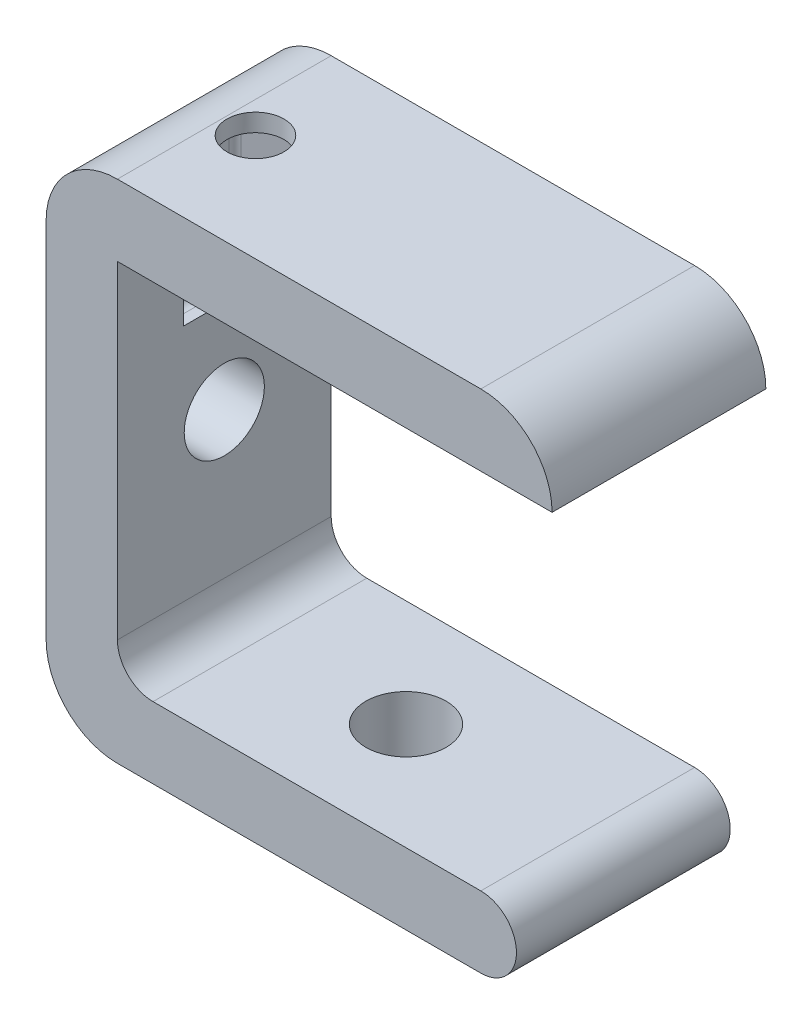
ISO-10303-21;
HEADER;
FILE_DESCRIPTION(('STEP AP214'),'2;1');
FILE_NAME('part.step','',(''),(''),'','','');
FILE_SCHEMA(('AUTOMOTIVE_DESIGN { 1 0 10303 214 1 1 1 1 }'));
ENDSEC;
DATA;
#1=APPLICATION_CONTEXT('core data for automotive mechanical design processes');
#2=APPLICATION_PROTOCOL_DEFINITION('international standard','automotive_design',2000,#1);
#3=PRODUCT_CONTEXT('',#1,'mechanical');
#4=PRODUCT('Part','Part','',(#3));
#5=PRODUCT_RELATED_PRODUCT_CATEGORY('part','',(#4));
#6=PRODUCT_DEFINITION_FORMATION('','',#4);
#7=PRODUCT_DEFINITION_CONTEXT('part definition',#1,'design');
#8=PRODUCT_DEFINITION('design','',#6,#7);
#9=PRODUCT_DEFINITION_SHAPE('','',#8);
#10=(LENGTH_UNIT() NAMED_UNIT(*) SI_UNIT(.MILLI.,.METRE.));
#11=(NAMED_UNIT(*) PLANE_ANGLE_UNIT() SI_UNIT($,.RADIAN.));
#12=(NAMED_UNIT(*) SI_UNIT($,.STERADIAN.) SOLID_ANGLE_UNIT());
#13=UNCERTAINTY_MEASURE_WITH_UNIT(LENGTH_MEASURE(1.E-05),#10,'distance_accuracy_value','');
#14=(GEOMETRIC_REPRESENTATION_CONTEXT(3) GLOBAL_UNCERTAINTY_ASSIGNED_CONTEXT((#13)) GLOBAL_UNIT_ASSIGNED_CONTEXT((#10,
#11,#12)) REPRESENTATION_CONTEXT('',''));
#15=CARTESIAN_POINT('',(0.,0.,0.));
#16=DIRECTION('',(0.,0.,1.));
#17=DIRECTION('',(1.,0.,0.));
#18=AXIS2_PLACEMENT_3D('',#15,#16,#17);
#19=CARTESIAN_POINT('',(-10.2,0.,6.));
#20=DIRECTION('',(1.,0.,0.));
#21=DIRECTION('',(0.,0.,-1.));
#22=AXIS2_PLACEMENT_3D('',#19,#20,#21);
#23=PLANE('',#22);
#24=CARTESIAN_POINT('',(-10.2,0.,0.));
#25=DIRECTION('',(1.,0.,0.));
#26=DIRECTION('',(0.,0.,-1.));
#27=AXIS2_PLACEMENT_3D('',#24,#25,#26);
#28=CIRCLE('',#27,2.25);
#29=CARTESIAN_POINT('',(-10.2,0.,-2.25));
#30=VERTEX_POINT('',#29);
#31=EDGE_CURVE('E248',#30,#30,#28,.T.);
#32=ORIENTED_EDGE('',*,*,#31,.F.);
#33=EDGE_LOOP('',(#32));
#34=FACE_BOUND('',#33,.T.);
#35=DIRECTION('',(0.,-1.,0.));
#36=VECTOR('',#35,1.);
#37=CARTESIAN_POINT('',(-10.2,0.,6.));
#38=LINE('',#37,#36);
#39=CARTESIAN_POINT('',(-10.2,10.2,6.));
#40=VERTEX_POINT('',#39);
#41=CARTESIAN_POINT('',(-10.2,-8.2,6.));
#42=VERTEX_POINT('',#41);
#43=EDGE_CURVE('E303',#40,#42,#38,.T.);
#44=ORIENTED_EDGE('',*,*,#43,.T.);
#45=DIRECTION('',(0.,0.,-1.));
#46=VECTOR('',#45,1.);
#47=CARTESIAN_POINT('',(-10.2,-8.2,-6.));
#48=LINE('',#47,#46);
#49=CARTESIAN_POINT('',(-10.2,-8.2,-6.));
#50=VERTEX_POINT('',#49);
#51=EDGE_CURVE('E287',#42,#50,#48,.T.);
#52=ORIENTED_EDGE('',*,*,#51,.T.);
#53=DIRECTION('',(0.,-1.,0.));
#54=VECTOR('',#53,1.);
#55=CARTESIAN_POINT('',(-10.2,0.,-6.));
#56=LINE('',#55,#54);
#57=CARTESIAN_POINT('',(-10.2,10.2,-6.));
#58=VERTEX_POINT('',#57);
#59=EDGE_CURVE('E296',#58,#50,#56,.T.);
#60=ORIENTED_EDGE('',*,*,#59,.F.);
#61=DIRECTION('',(0.,0.,-1.));
#62=VECTOR('',#61,1.);
#63=CARTESIAN_POINT('',(-10.2,10.2,6.));
#64=LINE('',#63,#62);
#65=CARTESIAN_POINT('',(-10.2,10.2,-2.28053356329902));
#66=VERTEX_POINT('',#65);
#67=EDGE_CURVE('E211',#66,#58,#64,.T.);
#68=ORIENTED_EDGE('',*,*,#67,.F.);
#69=DIRECTION('',(0.,-1.,0.));
#70=VECTOR('',#69,1.);
#71=CARTESIAN_POINT('',(-10.2,0.,-2.28053356329902));
#72=LINE('',#71,#70);
#73=CARTESIAN_POINT('',(-10.2,5.2,-2.28053356329902));
#74=VERTEX_POINT('',#73);
#75=EDGE_CURVE('E193',#66,#74,#72,.T.);
#76=ORIENTED_EDGE('',*,*,#75,.T.);
#77=DIRECTION('',(0.,0.,-1.));
#78=VECTOR('',#77,1.);
#79=CARTESIAN_POINT('',(-10.2,5.2,6.));
#80=LINE('',#79,#78);
#81=CARTESIAN_POINT('',(-10.2,5.2,2.28053356329902));
#82=VERTEX_POINT('',#81);
#83=EDGE_CURVE('E190',#82,#74,#80,.T.);
#84=ORIENTED_EDGE('',*,*,#83,.F.);
#85=DIRECTION('',(0.,-1.,0.));
#86=VECTOR('',#85,1.);
#87=CARTESIAN_POINT('',(-10.2,0.,2.28053356329902));
#88=LINE('',#87,#86);
#89=CARTESIAN_POINT('',(-10.2,10.2,2.28053356329902));
#90=VERTEX_POINT('',#89);
#91=EDGE_CURVE('E183',#90,#82,#88,.T.);
#92=ORIENTED_EDGE('',*,*,#91,.F.);
#93=EDGE_CURVE('E186',#40,#90,#64,.T.);
#94=ORIENTED_EDGE('',*,*,#93,.F.);
#95=EDGE_LOOP('',(#44,#52,#60,#68,#76,#84,#92,#94));
#96=FACE_BOUND('',#95,.T.);
#97=ADVANCED_FACE('F34',(#34,#96),#23,.T.);
#98=CARTESIAN_POINT('',(-8.45,5.67451660040609,0.));
#99=DIRECTION('',(0.,1.,0.));
#100=DIRECTION('',(0.,0.,1.));
#101=AXIS2_PLACEMENT_3D('',#98,#99,#100);
#102=CYLINDRICAL_SURFACE('',#101,1.6);
#103=CARTESIAN_POINT('',(-8.45,14.2,0.));
#104=DIRECTION('',(0.,1.,0.));
#105=DIRECTION('',(0.,0.,1.));
#106=AXIS2_PLACEMENT_3D('',#103,#104,#105);
#107=CIRCLE('',#106,1.6);
#108=CARTESIAN_POINT('',(-8.45,14.2,1.6));
#109=VERTEX_POINT('',#108);
#110=EDGE_CURVE('E221',#109,#109,#107,.T.);
#111=ORIENTED_EDGE('',*,*,#110,.T.);
#112=EDGE_LOOP('',(#111));
#113=FACE_BOUND('',#112,.T.);
#114=CARTESIAN_POINT('',(-8.45,13.2,0.));
#115=DIRECTION('',(0.,-1.,0.));
#116=DIRECTION('',(0.,0.,-1.));
#117=AXIS2_PLACEMENT_3D('',#114,#115,#116);
#118=CIRCLE('',#117,1.6);
#119=CARTESIAN_POINT('',(-8.45,13.2,-1.6));
#120=VERTEX_POINT('',#119);
#121=EDGE_CURVE('E219',#120,#120,#118,.F.);
#122=ORIENTED_EDGE('',*,*,#121,.F.);
#123=EDGE_LOOP('',(#122));
#124=FACE_BOUND('',#123,.T.);
#125=ADVANCED_FACE('F401',(#113,#124),#102,.F.);
#126=CARTESIAN_POINT('',(0.,-10.2,6.));
#127=DIRECTION('',(0.,1.,0.));
#128=DIRECTION('',(0.,0.,1.));
#129=AXIS2_PLACEMENT_3D('',#126,#127,#128);
#130=PLANE('',#129);
#131=CARTESIAN_POINT('',(0.,-10.2,0.));
#132=DIRECTION('',(0.,1.,0.));
#133=DIRECTION('',(0.,0.,1.));
#134=AXIS2_PLACEMENT_3D('',#131,#132,#133);
#135=CIRCLE('',#134,2.25);
#136=CARTESIAN_POINT('',(0.,-10.2,2.25));
#137=VERTEX_POINT('',#136);
#138=EDGE_CURVE('E502',#137,#137,#135,.T.);
#139=ORIENTED_EDGE('',*,*,#138,.F.);
#140=EDGE_LOOP('',(#139));
#141=FACE_BOUND('',#140,.T.);
#142=DIRECTION('',(1.,0.,0.));
#143=VECTOR('',#142,1.);
#144=CARTESIAN_POINT('',(0.,-10.2,6.));
#145=LINE('',#144,#143);
#146=CARTESIAN_POINT('',(-8.2,-10.2,6.));
#147=VERTEX_POINT('',#146);
#148=CARTESIAN_POINT('',(10.2,-10.2,6.));
#149=VERTEX_POINT('',#148);
#150=EDGE_CURVE('E304',#147,#149,#145,.T.);
#151=ORIENTED_EDGE('',*,*,#150,.T.);
#152=DIRECTION('',(0.,0.,1.));
#153=VECTOR('',#152,1.);
#154=CARTESIAN_POINT('',(10.2,-10.2,6.));
#155=LINE('',#154,#153);
#156=CARTESIAN_POINT('',(10.2,-10.2,-6.));
#157=VERTEX_POINT('',#156);
#158=EDGE_CURVE('E280',#149,#157,#155,.F.);
#159=ORIENTED_EDGE('',*,*,#158,.T.);
#160=DIRECTION('',(1.,0.,0.));
#161=VECTOR('',#160,1.);
#162=CARTESIAN_POINT('',(0.,-10.2,-6.));
#163=LINE('',#162,#161);
#164=CARTESIAN_POINT('',(-8.2,-10.2,-6.));
#165=VERTEX_POINT('',#164);
#166=EDGE_CURVE('E293',#165,#157,#163,.T.);
#167=ORIENTED_EDGE('',*,*,#166,.F.);
#168=DIRECTION('',(0.,0.,-1.));
#169=VECTOR('',#168,1.);
#170=CARTESIAN_POINT('',(-8.2,-10.2,6.));
#171=LINE('',#170,#169);
#172=EDGE_CURVE('E278',#165,#147,#171,.F.);
#173=ORIENTED_EDGE('',*,*,#172,.T.);
#174=EDGE_LOOP('',(#151,#159,#167,#173));
#175=FACE_BOUND('',#174,.T.);
#176=ADVANCED_FACE('F299',(#141,#175),#130,.T.);
#177=CARTESIAN_POINT('',(0.,10.2,6.));
#178=DIRECTION('',(0.,1.,0.));
#179=DIRECTION('',(0.,0.,1.));
#180=AXIS2_PLACEMENT_3D('',#177,#178,#179);
#181=PLANE('',#180);
#182=DIRECTION('',(0.866025403784439,0.,0.5));
#183=VECTOR('',#182,1.);
#184=CARTESIAN_POINT('',(-8.45,10.2,-3.29089653438087));
#185=LINE('',#184,#183);
#186=CARTESIAN_POINT('',(-8.45,10.2,-3.29089653438087));
#187=VERTEX_POINT('',#186);
#188=CARTESIAN_POINT('',(-5.6,10.2,-1.64544826719043));
#189=VERTEX_POINT('',#188);
#190=EDGE_CURVE('E387',#187,#189,#185,.T.);
#191=ORIENTED_EDGE('',*,*,#190,.F.);
#192=DIRECTION('',(0.866025403784438,0.,-0.5));
#193=VECTOR('',#192,1.);
#194=CARTESIAN_POINT('',(-11.3,10.2,-1.64544826719043));
#195=LINE('',#194,#193);
#196=EDGE_CURVE('E204',#66,#187,#195,.T.);
#197=ORIENTED_EDGE('',*,*,#196,.F.);
#198=ORIENTED_EDGE('',*,*,#67,.T.);
#199=DIRECTION('',(1.,0.,0.));
#200=VECTOR('',#199,1.);
#201=CARTESIAN_POINT('',(0.,10.2,-6.));
#202=LINE('',#201,#200);
#203=CARTESIAN_POINT('',(14.2,10.2,-6.));
#204=VERTEX_POINT('',#203);
#205=EDGE_CURVE('E321',#58,#204,#202,.T.);
#206=ORIENTED_EDGE('',*,*,#205,.T.);
#207=DIRECTION('',(0.,0.,-1.));
#208=VECTOR('',#207,1.);
#209=CARTESIAN_POINT('',(14.2,10.2,6.));
#210=LINE('',#209,#208);
#211=CARTESIAN_POINT('',(14.2,10.2,6.));
#212=VERTEX_POINT('',#211);
#213=EDGE_CURVE('E215',#212,#204,#210,.T.);
#214=ORIENTED_EDGE('',*,*,#213,.F.);
#215=DIRECTION('',(1.,0.,0.));
#216=VECTOR('',#215,1.);
#217=CARTESIAN_POINT('',(0.,10.2,6.));
#218=LINE('',#217,#216);
#219=EDGE_CURVE('E210',#40,#212,#218,.T.);
#220=ORIENTED_EDGE('',*,*,#219,.F.);
#221=ORIENTED_EDGE('',*,*,#93,.T.);
#222=DIRECTION('',(-0.866025403784438,0.,-0.5));
#223=VECTOR('',#222,1.);
#224=CARTESIAN_POINT('',(-8.45,10.2,3.29089653438087));
#225=LINE('',#224,#223);
#226=CARTESIAN_POINT('',(-8.45,10.2,3.29089653438087));
#227=VERTEX_POINT('',#226);
#228=EDGE_CURVE('E198',#227,#90,#225,.T.);
#229=ORIENTED_EDGE('',*,*,#228,.F.);
#230=DIRECTION('',(-0.866025403784439,0.,0.5));
#231=VECTOR('',#230,1.);
#232=CARTESIAN_POINT('',(-5.6,10.2,1.64544826719043));
#233=LINE('',#232,#231);
#234=CARTESIAN_POINT('',(-5.6,10.2,1.64544826719043));
#235=VERTEX_POINT('',#234);
#236=EDGE_CURVE('E205',#235,#227,#233,.T.);
#237=ORIENTED_EDGE('',*,*,#236,.F.);
#238=DIRECTION('',(0.,0.,1.));
#239=VECTOR('',#238,1.);
#240=CARTESIAN_POINT('',(-5.6,10.2,-1.64544826719043));
#241=LINE('',#240,#239);
#242=EDGE_CURVE('E372',#189,#235,#241,.T.);
#243=ORIENTED_EDGE('',*,*,#242,.F.);
#244=EDGE_LOOP('',(#191,#197,#198,#206,#214,#220,#221,#229,#237,#243));
#245=FACE_BOUND('',#244,.T.);
#246=ADVANCED_FACE('F208',(#245),#181,.F.);
#247=CARTESIAN_POINT('',(0.,14.2,6.));
#248=DIRECTION('',(0.,1.,0.));
#249=DIRECTION('',(0.,0.,1.));
#250=AXIS2_PLACEMENT_3D('',#247,#248,#249);
#251=PLANE('',#250);
#252=ORIENTED_EDGE('',*,*,#110,.F.);
#253=EDGE_LOOP('',(#252));
#254=FACE_BOUND('',#253,.T.);
#255=DIRECTION('',(1.,0.,0.));
#256=VECTOR('',#255,1.);
#257=CARTESIAN_POINT('',(0.,14.2,-6.));
#258=LINE('',#257,#256);
#259=CARTESIAN_POINT('',(-10.2,14.2,-6.));
#260=VERTEX_POINT('',#259);
#261=CARTESIAN_POINT('',(10.2,14.2,-6.));
#262=VERTEX_POINT('',#261);
#263=EDGE_CURVE('E324',#260,#262,#258,.T.);
#264=ORIENTED_EDGE('',*,*,#263,.F.);
#265=DIRECTION('',(0.,0.,-1.));
#266=VECTOR('',#265,1.);
#267=CARTESIAN_POINT('',(-10.2,14.2,6.));
#268=LINE('',#267,#266);
#269=CARTESIAN_POINT('',(-10.2,14.2,6.));
#270=VERTEX_POINT('',#269);
#271=EDGE_CURVE('E276',#260,#270,#268,.F.);
#272=ORIENTED_EDGE('',*,*,#271,.T.);
#273=DIRECTION('',(1.,0.,0.));
#274=VECTOR('',#273,1.);
#275=CARTESIAN_POINT('',(0.,14.2,6.));
#276=LINE('',#275,#274);
#277=CARTESIAN_POINT('',(10.2,14.2,6.));
#278=VERTEX_POINT('',#277);
#279=EDGE_CURVE('E306',#270,#278,#276,.T.);
#280=ORIENTED_EDGE('',*,*,#279,.T.);
#281=DIRECTION('',(0.,0.,-1.));
#282=VECTOR('',#281,1.);
#283=CARTESIAN_POINT('',(10.2,14.2,6.));
#284=LINE('',#283,#282);
#285=EDGE_CURVE('E273',#278,#262,#284,.T.);
#286=ORIENTED_EDGE('',*,*,#285,.T.);
#287=EDGE_LOOP('',(#264,#272,#280,#286));
#288=FACE_BOUND('',#287,.T.);
#289=ADVANCED_FACE('F355',(#254,#288),#251,.T.);
#290=CARTESIAN_POINT('',(-14.2,0.,6.));
#291=DIRECTION('',(1.,0.,0.));
#292=DIRECTION('',(0.,0.,-1.));
#293=AXIS2_PLACEMENT_3D('',#290,#291,#292);
#294=PLANE('',#293);
#295=CARTESIAN_POINT('',(-14.2,0.,0.));
#296=DIRECTION('',(-1.,0.,0.));
#297=DIRECTION('',(0.,0.,1.));
#298=AXIS2_PLACEMENT_3D('',#295,#296,#297);
#299=CIRCLE('',#298,2.25);
#300=CARTESIAN_POINT('',(-14.2,0.,2.25));
#301=VERTEX_POINT('',#300);
#302=EDGE_CURVE('E505',#301,#301,#299,.T.);
#303=ORIENTED_EDGE('',*,*,#302,.F.);
#304=EDGE_LOOP('',(#303));
#305=FACE_BOUND('',#304,.T.);
#306=DIRECTION('',(0.,-1.,0.));
#307=VECTOR('',#306,1.);
#308=CARTESIAN_POINT('',(-14.2,0.,-6.));
#309=LINE('',#308,#307);
#310=CARTESIAN_POINT('',(-14.2,10.2,-6.));
#311=VERTEX_POINT('',#310);
#312=CARTESIAN_POINT('',(-14.2,-10.2,-6.));
#313=VERTEX_POINT('',#312);
#314=EDGE_CURVE('E327',#311,#313,#309,.T.);
#315=ORIENTED_EDGE('',*,*,#314,.T.);
#316=DIRECTION('',(0.,0.,-1.));
#317=VECTOR('',#316,1.);
#318=CARTESIAN_POINT('',(-14.2,-10.2,6.));
#319=LINE('',#318,#317);
#320=CARTESIAN_POINT('',(-14.2,-10.2,6.));
#321=VERTEX_POINT('',#320);
#322=EDGE_CURVE('E265',#313,#321,#319,.F.);
#323=ORIENTED_EDGE('',*,*,#322,.T.);
#324=DIRECTION('',(0.,-1.,0.));
#325=VECTOR('',#324,1.);
#326=CARTESIAN_POINT('',(-14.2,0.,6.));
#327=LINE('',#326,#325);
#328=CARTESIAN_POINT('',(-14.2,10.2,6.));
#329=VERTEX_POINT('',#328);
#330=EDGE_CURVE('E314',#329,#321,#327,.T.);
#331=ORIENTED_EDGE('',*,*,#330,.F.);
#332=DIRECTION('',(0.,0.,-1.));
#333=VECTOR('',#332,1.);
#334=CARTESIAN_POINT('',(-14.2,10.2,-6.));
#335=LINE('',#334,#333);
#336=EDGE_CURVE('E262',#329,#311,#335,.T.);
#337=ORIENTED_EDGE('',*,*,#336,.T.);
#338=EDGE_LOOP('',(#315,#323,#331,#337));
#339=FACE_BOUND('',#338,.T.);
#340=ADVANCED_FACE('F346',(#305,#339),#294,.F.);
#341=CARTESIAN_POINT('',(0.,-14.2,6.));
#342=DIRECTION('',(0.,1.,0.));
#343=DIRECTION('',(0.,0.,1.));
#344=AXIS2_PLACEMENT_3D('',#341,#342,#343);
#345=PLANE('',#344);
#346=CARTESIAN_POINT('',(0.,-14.2,0.));
#347=DIRECTION('',(0.,-1.,0.));
#348=DIRECTION('',(0.,0.,-1.));
#349=AXIS2_PLACEMENT_3D('',#346,#347,#348);
#350=CIRCLE('',#349,2.25);
#351=CARTESIAN_POINT('',(0.,-14.2,-2.25));
#352=VERTEX_POINT('',#351);
#353=EDGE_CURVE('E500',#352,#352,#350,.T.);
#354=ORIENTED_EDGE('',*,*,#353,.F.);
#355=EDGE_LOOP('',(#354));
#356=FACE_BOUND('',#355,.T.);
#357=DIRECTION('',(1.,0.,0.));
#358=VECTOR('',#357,1.);
#359=CARTESIAN_POINT('',(0.,-14.2,6.));
#360=LINE('',#359,#358);
#361=CARTESIAN_POINT('',(-10.2,-14.2,6.));
#362=VERTEX_POINT('',#361);
#363=CARTESIAN_POINT('',(10.2,-14.2,6.));
#364=VERTEX_POINT('',#363);
#365=EDGE_CURVE('E317',#362,#364,#360,.T.);
#366=ORIENTED_EDGE('',*,*,#365,.F.);
#367=DIRECTION('',(0.,0.,-1.));
#368=VECTOR('',#367,1.);
#369=CARTESIAN_POINT('',(-10.2,-14.2,6.));
#370=LINE('',#369,#368);
#371=CARTESIAN_POINT('',(-10.2,-14.2,-6.));
#372=VERTEX_POINT('',#371);
#373=EDGE_CURVE('E253',#362,#372,#370,.T.);
#374=ORIENTED_EDGE('',*,*,#373,.T.);
#375=DIRECTION('',(1.,0.,0.));
#376=VECTOR('',#375,1.);
#377=CARTESIAN_POINT('',(0.,-14.2,-6.));
#378=LINE('',#377,#376);
#379=CARTESIAN_POINT('',(10.2,-14.2,-6.));
#380=VERTEX_POINT('',#379);
#381=EDGE_CURVE('E308',#372,#380,#378,.T.);
#382=ORIENTED_EDGE('',*,*,#381,.T.);
#383=DIRECTION('',(0.,0.,-1.));
#384=VECTOR('',#383,1.);
#385=CARTESIAN_POINT('',(10.2,-14.2,6.));
#386=LINE('',#385,#384);
#387=EDGE_CURVE('E244',#380,#364,#386,.F.);
#388=ORIENTED_EDGE('',*,*,#387,.T.);
#389=EDGE_LOOP('',(#366,#374,#382,#388));
#390=FACE_BOUND('',#389,.T.);
#391=ADVANCED_FACE('F334',(#356,#390),#345,.F.);
#392=CARTESIAN_POINT('',(0.,0.,6.));
#393=DIRECTION('',(0.,0.,1.));
#394=DIRECTION('',(1.,0.,0.));
#395=AXIS2_PLACEMENT_3D('',#392,#393,#394);
#396=PLANE('',#395);
#397=ORIENTED_EDGE('',*,*,#365,.T.);
#398=CARTESIAN_POINT('',(10.2,-12.2,6.));
#399=DIRECTION('',(0.,0.,1.));
#400=DIRECTION('',(1.,0.,0.));
#401=AXIS2_PLACEMENT_3D('',#398,#399,#400);
#402=CIRCLE('',#401,2.);
#403=EDGE_CURVE('E285',#364,#149,#402,.T.);
#404=ORIENTED_EDGE('',*,*,#403,.T.);
#405=ORIENTED_EDGE('',*,*,#150,.F.);
#406=CARTESIAN_POINT('',(-8.2,-8.2,6.));
#407=DIRECTION('',(0.,0.,1.));
#408=DIRECTION('',(1.,0.,0.));
#409=AXIS2_PLACEMENT_3D('',#406,#407,#408);
#410=CIRCLE('',#409,2.);
#411=EDGE_CURVE('E11',#147,#42,#410,.F.);
#412=ORIENTED_EDGE('',*,*,#411,.T.);
#413=ORIENTED_EDGE('',*,*,#43,.F.);
#414=ORIENTED_EDGE('',*,*,#219,.T.);
#415=CARTESIAN_POINT('',(10.2,10.2,6.));
#416=DIRECTION('',(0.,0.,1.));
#417=DIRECTION('',(1.,0.,0.));
#418=AXIS2_PLACEMENT_3D('',#415,#416,#417);
#419=CIRCLE('',#418,4.);
#420=EDGE_CURVE('E267',#212,#278,#419,.T.);
#421=ORIENTED_EDGE('',*,*,#420,.T.);
#422=ORIENTED_EDGE('',*,*,#279,.F.);
#423=CARTESIAN_POINT('',(-10.2,10.2,6.));
#424=DIRECTION('',(0.,0.,1.));
#425=DIRECTION('',(1.,0.,0.));
#426=AXIS2_PLACEMENT_3D('',#423,#424,#425);
#427=CIRCLE('',#426,4.);
#428=EDGE_CURVE('E269',#270,#329,#427,.T.);
#429=ORIENTED_EDGE('',*,*,#428,.T.);
#430=ORIENTED_EDGE('',*,*,#330,.T.);
#431=CARTESIAN_POINT('',(-10.2,-10.2,6.));
#432=DIRECTION('',(0.,0.,1.));
#433=DIRECTION('',(1.,0.,0.));
#434=AXIS2_PLACEMENT_3D('',#431,#432,#433);
#435=CIRCLE('',#434,4.);
#436=EDGE_CURVE('E271',#321,#362,#435,.T.);
#437=ORIENTED_EDGE('',*,*,#436,.T.);
#438=EDGE_LOOP('',(#397,#404,#405,#412,#413,#414,#421,#422,#429,#430,#437));
#439=FACE_BOUND('',#438,.T.);
#440=ADVANCED_FACE('F339',(#439),#396,.T.);
#441=CARTESIAN_POINT('',(0.,0.,-6.));
#442=DIRECTION('',(0.,0.,1.));
#443=DIRECTION('',(1.,0.,0.));
#444=AXIS2_PLACEMENT_3D('',#441,#442,#443);
#445=PLANE('',#444);
#446=ORIENTED_EDGE('',*,*,#166,.T.);
#447=CARTESIAN_POINT('',(10.2,-12.2,-6.));
#448=DIRECTION('',(0.,0.,1.));
#449=DIRECTION('',(1.,0.,0.));
#450=AXIS2_PLACEMENT_3D('',#447,#448,#449);
#451=CIRCLE('',#450,2.);
#452=EDGE_CURVE('E283',#157,#380,#451,.F.);
#453=ORIENTED_EDGE('',*,*,#452,.T.);
#454=ORIENTED_EDGE('',*,*,#381,.F.);
#455=CARTESIAN_POINT('',(-10.2,-10.2,-6.));
#456=DIRECTION('',(0.,0.,1.));
#457=DIRECTION('',(1.,0.,0.));
#458=AXIS2_PLACEMENT_3D('',#455,#456,#457);
#459=CIRCLE('',#458,4.);
#460=EDGE_CURVE('E260',#372,#313,#459,.F.);
#461=ORIENTED_EDGE('',*,*,#460,.T.);
#462=ORIENTED_EDGE('',*,*,#314,.F.);
#463=CARTESIAN_POINT('',(-10.2,10.2,-6.));
#464=DIRECTION('',(0.,0.,1.));
#465=DIRECTION('',(1.,0.,0.));
#466=AXIS2_PLACEMENT_3D('',#463,#464,#465);
#467=CIRCLE('',#466,4.);
#468=EDGE_CURVE('E258',#311,#260,#467,.F.);
#469=ORIENTED_EDGE('',*,*,#468,.T.);
#470=ORIENTED_EDGE('',*,*,#263,.T.);
#471=CARTESIAN_POINT('',(10.2,10.2,-6.));
#472=DIRECTION('',(0.,0.,1.));
#473=DIRECTION('',(1.,0.,0.));
#474=AXIS2_PLACEMENT_3D('',#471,#472,#473);
#475=CIRCLE('',#474,4.);
#476=EDGE_CURVE('E256',#262,#204,#475,.F.);
#477=ORIENTED_EDGE('',*,*,#476,.T.);
#478=ORIENTED_EDGE('',*,*,#205,.F.);
#479=ORIENTED_EDGE('',*,*,#59,.T.);
#480=CARTESIAN_POINT('',(-8.2,-8.2,-6.));
#481=DIRECTION('',(0.,0.,1.));
#482=DIRECTION('',(1.,0.,0.));
#483=AXIS2_PLACEMENT_3D('',#480,#481,#482);
#484=CIRCLE('',#483,2.);
#485=EDGE_CURVE('E42',#50,#165,#484,.T.);
#486=ORIENTED_EDGE('',*,*,#485,.T.);
#487=EDGE_LOOP('',(#446,#453,#454,#461,#462,#469,#470,#477,#478,#479,#486));
#488=FACE_BOUND('',#487,.T.);
#489=ADVANCED_FACE('F292',(#488),#445,.F.);
#490=CARTESIAN_POINT('',(0.,13.2,0.));
#491=DIRECTION('',(0.,-1.,0.));
#492=DIRECTION('',(0.,0.,-1.));
#493=AXIS2_PLACEMENT_3D('',#490,#491,#492);
#494=PLANE('',#493);
#495=DIRECTION('',(-0.866025403784438,0.,-0.5));
#496=VECTOR('',#495,1.);
#497=CARTESIAN_POINT('',(-8.45,13.2,3.29089653438087));
#498=LINE('',#497,#496);
#499=CARTESIAN_POINT('',(-8.45,13.2,3.29089653438087));
#500=VERTEX_POINT('',#499);
#501=CARTESIAN_POINT('',(-11.05,13.2,1.78978583448784));
#502=VERTEX_POINT('',#501);
#503=EDGE_CURVE('E371',#500,#502,#498,.T.);
#504=ORIENTED_EDGE('',*,*,#503,.T.);
#505=CARTESIAN_POINT('',(-10.8,13.2,1.35677313259562));
#506=DIRECTION('',(0.,-1.,0.));
#507=DIRECTION('',(0.,0.,-1.));
#508=AXIS2_PLACEMENT_3D('',#505,#506,#507);
#509=CIRCLE('',#508,0.5);
#510=CARTESIAN_POINT('',(-11.3,13.2,1.35677313259562));
#511=VERTEX_POINT('',#510);
#512=EDGE_CURVE('E236',#502,#511,#509,.T.);
#513=ORIENTED_EDGE('',*,*,#512,.T.);
#514=DIRECTION('',(0.,0.,-1.));
#515=VECTOR('',#514,1.);
#516=CARTESIAN_POINT('',(-11.3,13.2,1.64544826719043));
#517=LINE('',#516,#515);
#518=CARTESIAN_POINT('',(-11.3,13.2,-1.35677313259562));
#519=VERTEX_POINT('',#518);
#520=EDGE_CURVE('E375',#511,#519,#517,.T.);
#521=ORIENTED_EDGE('',*,*,#520,.T.);
#522=CARTESIAN_POINT('',(-10.8,13.2,-1.35677313259562));
#523=DIRECTION('',(0.,-1.,0.));
#524=DIRECTION('',(0.,0.,-1.));
#525=AXIS2_PLACEMENT_3D('',#522,#523,#524);
#526=CIRCLE('',#525,0.5);
#527=CARTESIAN_POINT('',(-11.05,13.2,-1.78978583448784));
#528=VERTEX_POINT('',#527);
#529=EDGE_CURVE('E234',#519,#528,#526,.T.);
#530=ORIENTED_EDGE('',*,*,#529,.T.);
#531=DIRECTION('',(0.866025403784438,0.,-0.5));
#532=VECTOR('',#531,1.);
#533=CARTESIAN_POINT('',(-11.3,13.2,-1.64544826719043));
#534=LINE('',#533,#532);
#535=CARTESIAN_POINT('',(-8.45,13.2,-3.29089653438087));
#536=VERTEX_POINT('',#535);
#537=EDGE_CURVE('E378',#528,#536,#534,.T.);
#538=ORIENTED_EDGE('',*,*,#537,.T.);
#539=DIRECTION('',(0.866025403784439,0.,0.5));
#540=VECTOR('',#539,1.);
#541=CARTESIAN_POINT('',(-8.45,13.2,-3.29089653438087));
#542=LINE('',#541,#540);
#543=CARTESIAN_POINT('',(-5.6,13.2,-1.64544826719043));
#544=VERTEX_POINT('',#543);
#545=EDGE_CURVE('E380',#536,#544,#542,.T.);
#546=ORIENTED_EDGE('',*,*,#545,.T.);
#547=DIRECTION('',(0.,0.,1.));
#548=VECTOR('',#547,1.);
#549=CARTESIAN_POINT('',(-5.6,13.2,-1.64544826719043));
#550=LINE('',#549,#548);
#551=CARTESIAN_POINT('',(-5.6,13.2,1.64544826719043));
#552=VERTEX_POINT('',#551);
#553=EDGE_CURVE('E383',#544,#552,#550,.T.);
#554=ORIENTED_EDGE('',*,*,#553,.T.);
#555=DIRECTION('',(-0.866025403784439,0.,0.5));
#556=VECTOR('',#555,1.);
#557=CARTESIAN_POINT('',(-5.6,13.2,1.64544826719043));
#558=LINE('',#557,#556);
#559=EDGE_CURVE('E368',#552,#500,#558,.T.);
#560=ORIENTED_EDGE('',*,*,#559,.T.);
#561=EDGE_LOOP('',(#504,#513,#521,#530,#538,#546,#554,#560));
#562=FACE_BOUND('',#561,.T.);
#563=ORIENTED_EDGE('',*,*,#121,.T.);
#564=EDGE_LOOP('',(#563));
#565=FACE_BOUND('',#564,.T.);
#566=ADVANCED_FACE('F465',(#562,#565),#494,.T.);
#567=CARTESIAN_POINT('',(-5.6,13.2,1.64544826719043));
#568=DIRECTION('',(0.5,0.,0.866025403784439));
#569=DIRECTION('',(0.866025403784439,0.,-0.5));
#570=AXIS2_PLACEMENT_3D('',#567,#568,#569);
#571=PLANE('',#570);
#572=ORIENTED_EDGE('',*,*,#236,.T.);
#573=DIRECTION('',(0.,-1.,0.));
#574=VECTOR('',#573,1.);
#575=CARTESIAN_POINT('',(-8.45,13.2,3.29089653438087));
#576=LINE('',#575,#574);
#577=EDGE_CURVE('E201',#500,#227,#576,.T.);
#578=ORIENTED_EDGE('',*,*,#577,.F.);
#579=ORIENTED_EDGE('',*,*,#559,.F.);
#580=DIRECTION('',(0.,-1.,0.));
#581=VECTOR('',#580,1.);
#582=CARTESIAN_POINT('',(-5.6,13.2,1.64544826719043));
#583=LINE('',#582,#581);
#584=EDGE_CURVE('E222',#552,#235,#583,.T.);
#585=ORIENTED_EDGE('',*,*,#584,.T.);
#586=EDGE_LOOP('',(#572,#578,#579,#585));
#587=FACE_BOUND('',#586,.T.);
#588=ADVANCED_FACE('F468',(#587),#571,.F.);
#589=CARTESIAN_POINT('',(-5.6,13.2,-1.64544826719043));
#590=DIRECTION('',(1.,0.,0.));
#591=DIRECTION('',(0.,0.,-1.));
#592=AXIS2_PLACEMENT_3D('',#589,#590,#591);
#593=PLANE('',#592);
#594=ORIENTED_EDGE('',*,*,#242,.T.);
#595=ORIENTED_EDGE('',*,*,#584,.F.);
#596=ORIENTED_EDGE('',*,*,#553,.F.);
#597=DIRECTION('',(0.,-1.,0.));
#598=VECTOR('',#597,1.);
#599=CARTESIAN_POINT('',(-5.6,13.2,-1.64544826719043));
#600=LINE('',#599,#598);
#601=EDGE_CURVE('E393',#544,#189,#600,.T.);
#602=ORIENTED_EDGE('',*,*,#601,.T.);
#603=EDGE_LOOP('',(#594,#595,#596,#602));
#604=FACE_BOUND('',#603,.T.);
#605=ADVANCED_FACE('F470',(#604),#593,.F.);
#606=CARTESIAN_POINT('',(-8.45,13.2,-3.29089653438087));
#607=DIRECTION('',(0.5,0.,-0.866025403784439));
#608=DIRECTION('',(-0.866025403784439,0.,-0.5));
#609=AXIS2_PLACEMENT_3D('',#606,#607,#608);
#610=PLANE('',#609);
#611=ORIENTED_EDGE('',*,*,#190,.T.);
#612=ORIENTED_EDGE('',*,*,#601,.F.);
#613=ORIENTED_EDGE('',*,*,#545,.F.);
#614=DIRECTION('',(0.,-1.,0.));
#615=VECTOR('',#614,1.);
#616=CARTESIAN_POINT('',(-8.45,13.2,-3.29089653438087));
#617=LINE('',#616,#615);
#618=EDGE_CURVE('E395',#536,#187,#617,.T.);
#619=ORIENTED_EDGE('',*,*,#618,.T.);
#620=EDGE_LOOP('',(#611,#612,#613,#619));
#621=FACE_BOUND('',#620,.T.);
#622=ADVANCED_FACE('F473',(#621),#610,.F.);
#623=CARTESIAN_POINT('',(-11.3,13.2,-1.64544826719043));
#624=DIRECTION('',(-0.5,0.,-0.866025403784439));
#625=DIRECTION('',(-0.866025403784439,0.,0.5));
#626=AXIS2_PLACEMENT_3D('',#623,#624,#625);
#627=PLANE('',#626);
#628=DIRECTION('',(0.,-1.,0.));
#629=VECTOR('',#628,1.);
#630=CARTESIAN_POINT('',(-11.05,5.2,-1.78978583448784));
#631=LINE('',#630,#629);
#632=CARTESIAN_POINT('',(-11.05,5.26698729810775,-1.78978583448784));
#633=VERTEX_POINT('',#632);
#634=EDGE_CURVE('E238',#528,#633,#631,.T.);
#635=ORIENTED_EDGE('',*,*,#634,.T.);
#636=CARTESIAN_POINT('',(-10.8,5.69999999999999,-1.93412340178525));
#637=DIRECTION('',(-0.5,0.,-0.866025403784439));
#638=DIRECTION('',(-0.866025403784439,0.,0.5));
#639=AXIS2_PLACEMENT_3D('',#636,#637,#638);
#640=ELLIPSE('',#639,0.577350269189626,0.5);
#641=CARTESIAN_POINT('',(-10.8,5.2,-1.93412340178525));
#642=VERTEX_POINT('',#641);
#643=EDGE_CURVE('E240',#633,#642,#640,.F.);
#644=ORIENTED_EDGE('',*,*,#643,.T.);
#645=DIRECTION('',(0.866025403784439,0.,-0.5));
#646=VECTOR('',#645,1.);
#647=CARTESIAN_POINT('',(-3.5375,5.2,-6.1271297317749));
#648=LINE('',#647,#646);
#649=EDGE_CURVE('E251',#642,#74,#648,.T.);
#650=ORIENTED_EDGE('',*,*,#649,.T.);
#651=ORIENTED_EDGE('',*,*,#75,.F.);
#652=ORIENTED_EDGE('',*,*,#196,.T.);
#653=ORIENTED_EDGE('',*,*,#618,.F.);
#654=ORIENTED_EDGE('',*,*,#537,.F.);
#655=EDGE_LOOP('',(#635,#644,#650,#651,#652,#653,#654));
#656=FACE_BOUND('',#655,.T.);
#657=ADVANCED_FACE('F477',(#656),#627,.F.);
#658=CARTESIAN_POINT('',(-11.3,13.2,1.64544826719043));
#659=DIRECTION('',(-1.,0.,0.));
#660=DIRECTION('',(0.,0.,1.));
#661=AXIS2_PLACEMENT_3D('',#658,#659,#660);
#662=PLANE('',#661);
#663=ORIENTED_EDGE('',*,*,#520,.F.);
#664=DIRECTION('',(0.,-1.,0.));
#665=VECTOR('',#664,1.);
#666=CARTESIAN_POINT('',(-11.3,5.2,1.35677313259562));
#667=LINE('',#666,#665);
#668=CARTESIAN_POINT('',(-11.3,5.69999999999999,1.35677313259562));
#669=VERTEX_POINT('',#668);
#670=EDGE_CURVE('E227',#511,#669,#667,.T.);
#671=ORIENTED_EDGE('',*,*,#670,.T.);
#672=DIRECTION('',(0.,0.,-1.));
#673=VECTOR('',#672,1.);
#674=CARTESIAN_POINT('',(-11.3,5.69999999999999,-1.64544826719043));
#675=LINE('',#674,#673);
#676=CARTESIAN_POINT('',(-11.3,5.69999999999999,-1.35677313259562));
#677=VERTEX_POINT('',#676);
#678=EDGE_CURVE('E225',#669,#677,#675,.T.);
#679=ORIENTED_EDGE('',*,*,#678,.T.);
#680=DIRECTION('',(0.,-1.,0.));
#681=VECTOR('',#680,1.);
#682=CARTESIAN_POINT('',(-11.3,13.2,-1.35677313259562));
#683=LINE('',#682,#681);
#684=EDGE_CURVE('E213',#677,#519,#683,.F.);
#685=ORIENTED_EDGE('',*,*,#684,.T.);
#686=EDGE_LOOP('',(#663,#671,#679,#685));
#687=FACE_BOUND('',#686,.T.);
#688=ADVANCED_FACE('F481',(#687),#662,.F.);
#689=CARTESIAN_POINT('',(-8.45,13.2,3.29089653438087));
#690=DIRECTION('',(-0.5,0.,0.866025403784438));
#691=DIRECTION('',(0.866025403784439,0.,0.5));
#692=AXIS2_PLACEMENT_3D('',#689,#690,#691);
#693=PLANE('',#692);
#694=CARTESIAN_POINT('',(-10.8,5.69999999999999,1.93412340178525));
#695=DIRECTION('',(-0.5,0.,0.866025403784438));
#696=DIRECTION('',(0.866025403784439,0.,0.5));
#697=AXIS2_PLACEMENT_3D('',#694,#695,#696);
#698=ELLIPSE('',#697,0.577350269189626,0.5);
#699=CARTESIAN_POINT('',(-10.8,5.2,1.93412340178525));
#700=VERTEX_POINT('',#699);
#701=CARTESIAN_POINT('',(-11.05,5.26698729810775,1.78978583448784));
#702=VERTEX_POINT('',#701);
#703=EDGE_CURVE('E230',#700,#702,#698,.F.);
#704=ORIENTED_EDGE('',*,*,#703,.T.);
#705=DIRECTION('',(0.,-1.,0.));
#706=VECTOR('',#705,1.);
#707=CARTESIAN_POINT('',(-11.05,13.2,1.78978583448784));
#708=LINE('',#707,#706);
#709=EDGE_CURVE('E232',#702,#502,#708,.F.);
#710=ORIENTED_EDGE('',*,*,#709,.T.);
#711=ORIENTED_EDGE('',*,*,#503,.F.);
#712=ORIENTED_EDGE('',*,*,#577,.T.);
#713=ORIENTED_EDGE('',*,*,#228,.T.);
#714=ORIENTED_EDGE('',*,*,#91,.T.);
#715=DIRECTION('',(0.866025403784438,0.,0.5));
#716=VECTOR('',#715,1.);
#717=CARTESIAN_POINT('',(-3.5375,5.2,6.1271297317749));
#718=LINE('',#717,#716);
#719=EDGE_CURVE('E194',#700,#82,#718,.T.);
#720=ORIENTED_EDGE('',*,*,#719,.F.);
#721=EDGE_LOOP('',(#704,#710,#711,#712,#713,#714,#720));
#722=FACE_BOUND('',#721,.T.);
#723=ADVANCED_FACE('F199',(#722),#693,.F.);
#724=CARTESIAN_POINT('',(0.,5.2,0.));
#725=DIRECTION('',(0.,-1.,0.));
#726=DIRECTION('',(0.,0.,-1.));
#727=AXIS2_PLACEMENT_3D('',#724,#725,#726);
#728=PLANE('',#727);
#729=ORIENTED_EDGE('',*,*,#649,.F.);
#730=DIRECTION('',(0.,0.,-1.));
#731=VECTOR('',#730,1.);
#732=CARTESIAN_POINT('',(-10.8,5.2,1.64544826719044));
#733=LINE('',#732,#731);
#734=EDGE_CURVE('E242',#642,#700,#733,.F.);
#735=ORIENTED_EDGE('',*,*,#734,.T.);
#736=ORIENTED_EDGE('',*,*,#719,.T.);
#737=ORIENTED_EDGE('',*,*,#83,.T.);
#738=EDGE_LOOP('',(#729,#735,#736,#737));
#739=FACE_BOUND('',#738,.T.);
#740=ADVANCED_FACE('F436',(#739),#728,.F.);
#741=CARTESIAN_POINT('',(-10.8,13.2,-1.35677313259562));
#742=DIRECTION('',(0.,1.,0.));
#743=DIRECTION('',(0.,0.,1.));
#744=AXIS2_PLACEMENT_3D('',#741,#742,#743);
#745=CYLINDRICAL_SURFACE('',#744,0.5);
#746=ORIENTED_EDGE('',*,*,#529,.F.);
#747=ORIENTED_EDGE('',*,*,#684,.F.);
#748=CARTESIAN_POINT('',(-10.8,5.69999999999999,-1.35677313259562));
#749=DIRECTION('',(0.,-0.707106781186547,0.707106781186547));
#750=DIRECTION('',(0.,0.707106781186547,0.707106781186547));
#751=AXIS2_PLACEMENT_3D('',#748,#749,#750);
#752=ELLIPSE('',#751,0.707106781186547,0.5);
#753=EDGE_CURVE('E247',#633,#677,#752,.F.);
#754=ORIENTED_EDGE('',*,*,#753,.F.);
#755=ORIENTED_EDGE('',*,*,#634,.F.);
#756=EDGE_LOOP('',(#746,#747,#754,#755));
#757=FACE_BOUND('',#756,.T.);
#758=ADVANCED_FACE('F432',(#757),#745,.F.);
#759=CARTESIAN_POINT('',(-10.8,5.69999999999999,1.64544826719043));
#760=DIRECTION('',(0.,0.,1.));
#761=DIRECTION('',(1.,0.,0.));
#762=AXIS2_PLACEMENT_3D('',#759,#760,#761);
#763=CYLINDRICAL_SURFACE('',#762,0.5);
#764=ORIENTED_EDGE('',*,*,#753,.T.);
#765=ORIENTED_EDGE('',*,*,#678,.F.);
#766=CARTESIAN_POINT('',(-10.8,5.69999999999999,1.35677313259562));
#767=DIRECTION('',(0.,0.707106781186547,0.707106781186547));
#768=DIRECTION('',(0.,0.707106781186547,-0.707106781186547));
#769=AXIS2_PLACEMENT_3D('',#766,#767,#768);
#770=ELLIPSE('',#769,0.707106781186547,0.5);
#771=EDGE_CURVE('E245',#702,#669,#770,.F.);
#772=ORIENTED_EDGE('',*,*,#771,.F.);
#773=ORIENTED_EDGE('',*,*,#703,.F.);
#774=ORIENTED_EDGE('',*,*,#734,.F.);
#775=ORIENTED_EDGE('',*,*,#643,.F.);
#776=EDGE_LOOP('',(#764,#765,#772,#773,#774,#775));
#777=FACE_BOUND('',#776,.T.);
#778=ADVANCED_FACE('F428',(#777),#763,.F.);
#779=CARTESIAN_POINT('',(-10.8,13.2,1.35677313259562));
#780=DIRECTION('',(0.,1.,0.));
#781=DIRECTION('',(0.,0.,1.));
#782=AXIS2_PLACEMENT_3D('',#779,#780,#781);
#783=CYLINDRICAL_SURFACE('',#782,0.5);
#784=ORIENTED_EDGE('',*,*,#512,.F.);
#785=ORIENTED_EDGE('',*,*,#709,.F.);
#786=ORIENTED_EDGE('',*,*,#771,.T.);
#787=ORIENTED_EDGE('',*,*,#670,.F.);
#788=EDGE_LOOP('',(#784,#785,#786,#787));
#789=FACE_BOUND('',#788,.T.);
#790=ADVANCED_FACE('F425',(#789),#783,.F.);
#791=CARTESIAN_POINT('',(-10.2,-10.2,6.));
#792=DIRECTION('',(0.,0.,-1.));
#793=DIRECTION('',(-1.,0.,0.));
#794=AXIS2_PLACEMENT_3D('',#791,#792,#793);
#795=CYLINDRICAL_SURFACE('',#794,4.);
#796=ORIENTED_EDGE('',*,*,#436,.F.);
#797=ORIENTED_EDGE('',*,*,#322,.F.);
#798=ORIENTED_EDGE('',*,*,#460,.F.);
#799=ORIENTED_EDGE('',*,*,#373,.F.);
#800=EDGE_LOOP('',(#796,#797,#798,#799));
#801=FACE_BOUND('',#800,.T.);
#802=ADVANCED_FACE('F342',(#801),#795,.T.);
#803=CARTESIAN_POINT('',(-10.2,10.2,6.));
#804=DIRECTION('',(0.,0.,1.));
#805=DIRECTION('',(1.,0.,0.));
#806=AXIS2_PLACEMENT_3D('',#803,#804,#805);
#807=CYLINDRICAL_SURFACE('',#806,4.);
#808=ORIENTED_EDGE('',*,*,#428,.F.);
#809=ORIENTED_EDGE('',*,*,#271,.F.);
#810=ORIENTED_EDGE('',*,*,#468,.F.);
#811=ORIENTED_EDGE('',*,*,#336,.F.);
#812=EDGE_LOOP('',(#808,#809,#810,#811));
#813=FACE_BOUND('',#812,.T.);
#814=ADVANCED_FACE('F351',(#813),#807,.T.);
#815=CARTESIAN_POINT('',(10.2,10.2,6.));
#816=DIRECTION('',(0.,0.,-1.));
#817=DIRECTION('',(-1.,0.,0.));
#818=AXIS2_PLACEMENT_3D('',#815,#816,#817);
#819=CYLINDRICAL_SURFACE('',#818,4.);
#820=ORIENTED_EDGE('',*,*,#420,.F.);
#821=ORIENTED_EDGE('',*,*,#213,.T.);
#822=ORIENTED_EDGE('',*,*,#476,.F.);
#823=ORIENTED_EDGE('',*,*,#285,.F.);
#824=EDGE_LOOP('',(#820,#821,#822,#823));
#825=FACE_BOUND('',#824,.T.);
#826=ADVANCED_FACE('F360',(#825),#819,.T.);
#827=CARTESIAN_POINT('',(10.2,-12.2,6.));
#828=DIRECTION('',(0.,0.,1.));
#829=DIRECTION('',(1.,0.,0.));
#830=AXIS2_PLACEMENT_3D('',#827,#828,#829);
#831=CYLINDRICAL_SURFACE('',#830,2.);
#832=ORIENTED_EDGE('',*,*,#403,.F.);
#833=ORIENTED_EDGE('',*,*,#387,.F.);
#834=ORIENTED_EDGE('',*,*,#452,.F.);
#835=ORIENTED_EDGE('',*,*,#158,.F.);
#836=EDGE_LOOP('',(#832,#833,#834,#835));
#837=FACE_BOUND('',#836,.T.);
#838=ADVANCED_FACE('F338',(#837),#831,.T.);
#839=CARTESIAN_POINT('',(-8.2,-8.2,6.));
#840=DIRECTION('',(0.,0.,1.));
#841=DIRECTION('',(1.,0.,0.));
#842=AXIS2_PLACEMENT_3D('',#839,#840,#841);
#843=CYLINDRICAL_SURFACE('',#842,2.);
#844=ORIENTED_EDGE('',*,*,#411,.F.);
#845=ORIENTED_EDGE('',*,*,#172,.F.);
#846=ORIENTED_EDGE('',*,*,#485,.F.);
#847=ORIENTED_EDGE('',*,*,#51,.F.);
#848=EDGE_LOOP('',(#844,#845,#846,#847));
#849=FACE_BOUND('',#848,.T.);
#850=ADVANCED_FACE('F36',(#849),#843,.F.);
#851=CARTESIAN_POINT('',(-4.2,0.,0.));
#852=DIRECTION('',(-1.,0.,0.));
#853=DIRECTION('',(0.,0.,1.));
#854=AXIS2_PLACEMENT_3D('',#851,#852,#853);
#855=CYLINDRICAL_SURFACE('',#854,2.25);
#856=ORIENTED_EDGE('',*,*,#31,.T.);
#857=EDGE_LOOP('',(#856));
#858=FACE_BOUND('',#857,.T.);
#859=ORIENTED_EDGE('',*,*,#302,.T.);
#860=EDGE_LOOP('',(#859));
#861=FACE_BOUND('',#860,.T.);
#862=ADVANCED_FACE('F447',(#858,#861),#855,.F.);
#863=CARTESIAN_POINT('',(0.,-4.2,0.));
#864=DIRECTION('',(0.,-1.,0.));
#865=DIRECTION('',(0.,0.,-1.));
#866=AXIS2_PLACEMENT_3D('',#863,#864,#865);
#867=CYLINDRICAL_SURFACE('',#866,2.25);
#868=ORIENTED_EDGE('',*,*,#138,.T.);
#869=EDGE_LOOP('',(#868));
#870=FACE_BOUND('',#869,.T.);
#871=ORIENTED_EDGE('',*,*,#353,.T.);
#872=EDGE_LOOP('',(#871));
#873=FACE_BOUND('',#872,.T.);
#874=ADVANCED_FACE('F451',(#870,#873),#867,.F.);
#875=CLOSED_SHELL('',(#97,#125,#176,#246,#289,#340,#391,#440,#489,#566,#588,#605,#622,#657,#688,
#723,#740,#758,#778,#790,#802,#814,#826,#838,#850,#862,#874));
#876=MANIFOLD_SOLID_BREP('B2',#875);
#877=ADVANCED_BREP_SHAPE_REPRESENTATION('',(#18,#876),#14);
#878=SHAPE_DEFINITION_REPRESENTATION(#9,#877);
ENDSEC;
END-ISO-10303-21;
